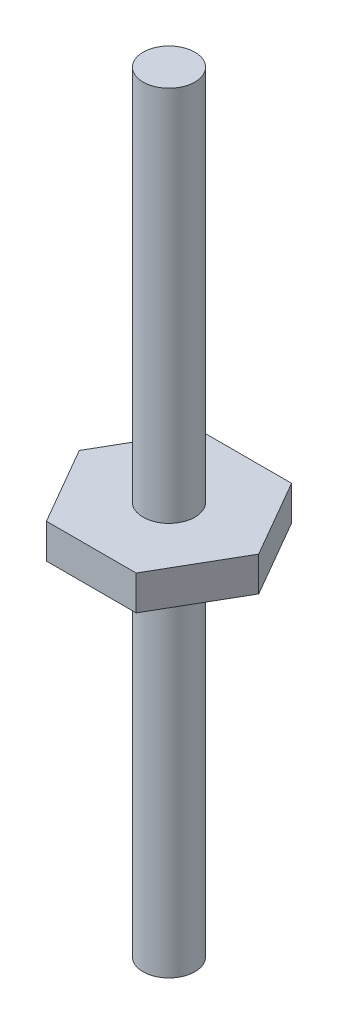
ISO-10303-21;
HEADER;
FILE_DESCRIPTION(('STEP AP214'),'2;1');
FILE_NAME('part.step','',(''),(''),'','','');
FILE_SCHEMA(('AUTOMOTIVE_DESIGN { 1 0 10303 214 1 1 1 1 }'));
ENDSEC;
DATA;
#1=APPLICATION_CONTEXT('core data for automotive mechanical design processes');
#2=APPLICATION_PROTOCOL_DEFINITION('international standard','automotive_design',2000,#1);
#3=PRODUCT_CONTEXT('',#1,'mechanical');
#4=PRODUCT('Part','Part','',(#3));
#5=PRODUCT_RELATED_PRODUCT_CATEGORY('part','',(#4));
#6=PRODUCT_DEFINITION_FORMATION('','',#4);
#7=PRODUCT_DEFINITION_CONTEXT('part definition',#1,'design');
#8=PRODUCT_DEFINITION('design','',#6,#7);
#9=PRODUCT_DEFINITION_SHAPE('','',#8);
#10=(LENGTH_UNIT() NAMED_UNIT(*) SI_UNIT(.MILLI.,.METRE.));
#11=(NAMED_UNIT(*) PLANE_ANGLE_UNIT() SI_UNIT($,.RADIAN.));
#12=(NAMED_UNIT(*) SI_UNIT($,.STERADIAN.) SOLID_ANGLE_UNIT());
#13=UNCERTAINTY_MEASURE_WITH_UNIT(LENGTH_MEASURE(1.E-05),#10,'distance_accuracy_value','');
#14=(GEOMETRIC_REPRESENTATION_CONTEXT(3) GLOBAL_UNCERTAINTY_ASSIGNED_CONTEXT((#13)) GLOBAL_UNIT_ASSIGNED_CONTEXT((#10,
#11,#12)) REPRESENTATION_CONTEXT('',''));
#15=CARTESIAN_POINT('',(0.,0.,0.));
#16=DIRECTION('',(0.,0.,1.));
#17=DIRECTION('',(1.,0.,0.));
#18=AXIS2_PLACEMENT_3D('',#15,#16,#17);
#19=CARTESIAN_POINT('',(0.,23.825,0.));
#20=DIRECTION('',(0.,-1.,0.));
#21=DIRECTION('',(0.,0.,-1.));
#22=AXIS2_PLACEMENT_3D('',#19,#20,#21);
#23=CYLINDRICAL_SURFACE('',#22,1.5);
#24=CARTESIAN_POINT('',(0.,23.825,0.));
#25=DIRECTION('',(0.,1.,0.));
#26=DIRECTION('',(0.,0.,1.));
#27=AXIS2_PLACEMENT_3D('',#24,#25,#26);
#28=CIRCLE('',#27,1.5);
#29=CARTESIAN_POINT('',(0.,23.825,1.5));
#30=VERTEX_POINT('',#29);
#31=EDGE_CURVE('E158',#30,#30,#28,.T.);
#32=ORIENTED_EDGE('',*,*,#31,.F.);
#33=EDGE_LOOP('',(#32));
#34=FACE_BOUND('',#33,.T.);
#35=CARTESIAN_POINT('',(0.,2.,0.));
#36=DIRECTION('',(0.,-1.,0.));
#37=DIRECTION('',(0.,0.,-1.));
#38=AXIS2_PLACEMENT_3D('',#35,#36,#37);
#39=CIRCLE('',#38,1.5);
#40=CARTESIAN_POINT('',(0.,2.,-1.5));
#41=VERTEX_POINT('',#40);
#42=EDGE_CURVE('E42',#41,#41,#39,.T.);
#43=ORIENTED_EDGE('',*,*,#42,.F.);
#44=EDGE_LOOP('',(#43));
#45=FACE_BOUND('',#44,.T.);
#46=ADVANCED_FACE('F39',(#34,#45),#23,.T.);
#47=CARTESIAN_POINT('',(0.,23.825,0.));
#48=DIRECTION('',(0.,1.,0.));
#49=DIRECTION('',(0.,0.,1.));
#50=AXIS2_PLACEMENT_3D('',#47,#48,#49);
#51=PLANE('',#50);
#52=ORIENTED_EDGE('',*,*,#31,.T.);
#53=EDGE_LOOP('',(#52));
#54=FACE_BOUND('',#53,.T.);
#55=ADVANCED_FACE('F177',(#54),#51,.T.);
#56=CARTESIAN_POINT('',(-2.59807621135332,2.,4.5));
#57=DIRECTION('',(-0.866025403784439,0.,0.5));
#58=DIRECTION('',(0.5,0.,0.866025403784439));
#59=AXIS2_PLACEMENT_3D('',#56,#57,#58);
#60=PLANE('',#59);
#61=DIRECTION('',(-0.5,0.,-0.866025403784439));
#62=VECTOR('',#61,1.);
#63=CARTESIAN_POINT('',(-2.59807621135332,0.,4.5));
#64=LINE('',#63,#62);
#65=CARTESIAN_POINT('',(-2.59807621135332,0.,4.5));
#66=VERTEX_POINT('',#65);
#67=CARTESIAN_POINT('',(-5.19615242270663,0.,0.));
#68=VERTEX_POINT('',#67);
#69=EDGE_CURVE('E133',#66,#68,#64,.T.);
#70=ORIENTED_EDGE('',*,*,#69,.F.);
#71=DIRECTION('',(0.,-1.,0.));
#72=VECTOR('',#71,1.);
#73=CARTESIAN_POINT('',(-2.59807621135332,2.,4.5));
#74=LINE('',#73,#72);
#75=CARTESIAN_POINT('',(-2.59807621135332,2.,4.5));
#76=VERTEX_POINT('',#75);
#77=EDGE_CURVE('E57',#76,#66,#74,.T.);
#78=ORIENTED_EDGE('',*,*,#77,.F.);
#79=DIRECTION('',(-0.5,0.,-0.866025403784439));
#80=VECTOR('',#79,1.);
#81=CARTESIAN_POINT('',(-2.59807621135332,2.,4.5));
#82=LINE('',#81,#80);
#83=CARTESIAN_POINT('',(-5.19615242270663,2.,0.));
#84=VERTEX_POINT('',#83);
#85=EDGE_CURVE('E155',#76,#84,#82,.T.);
#86=ORIENTED_EDGE('',*,*,#85,.T.);
#87=DIRECTION('',(0.,-1.,0.));
#88=VECTOR('',#87,1.);
#89=CARTESIAN_POINT('',(-5.19615242270663,2.,0.));
#90=LINE('',#89,#88);
#91=EDGE_CURVE('E92',#84,#68,#90,.T.);
#92=ORIENTED_EDGE('',*,*,#91,.T.);
#93=EDGE_LOOP('',(#70,#78,#86,#92));
#94=FACE_BOUND('',#93,.T.);
#95=ADVANCED_FACE('F182',(#94),#60,.T.);
#96=CARTESIAN_POINT('',(2.59807621135332,2.,4.5));
#97=DIRECTION('',(0.,0.,1.));
#98=DIRECTION('',(1.,0.,0.));
#99=AXIS2_PLACEMENT_3D('',#96,#97,#98);
#100=PLANE('',#99);
#101=DIRECTION('',(-1.,0.,0.));
#102=VECTOR('',#101,1.);
#103=CARTESIAN_POINT('',(2.59807621135332,0.,4.5));
#104=LINE('',#103,#102);
#105=CARTESIAN_POINT('',(2.59807621135332,0.,4.5));
#106=VERTEX_POINT('',#105);
#107=EDGE_CURVE('E151',#106,#66,#104,.T.);
#108=ORIENTED_EDGE('',*,*,#107,.F.);
#109=DIRECTION('',(0.,-1.,0.));
#110=VECTOR('',#109,1.);
#111=CARTESIAN_POINT('',(2.59807621135332,2.,4.5));
#112=LINE('',#111,#110);
#113=CARTESIAN_POINT('',(2.59807621135332,2.,4.5));
#114=VERTEX_POINT('',#113);
#115=EDGE_CURVE('E80',#114,#106,#112,.T.);
#116=ORIENTED_EDGE('',*,*,#115,.F.);
#117=DIRECTION('',(-1.,0.,0.));
#118=VECTOR('',#117,1.);
#119=CARTESIAN_POINT('',(2.59807621135332,2.,4.5));
#120=LINE('',#119,#118);
#121=EDGE_CURVE('E119',#114,#76,#120,.T.);
#122=ORIENTED_EDGE('',*,*,#121,.T.);
#123=ORIENTED_EDGE('',*,*,#77,.T.);
#124=EDGE_LOOP('',(#108,#116,#122,#123));
#125=FACE_BOUND('',#124,.T.);
#126=ADVANCED_FACE('F187',(#125),#100,.T.);
#127=CARTESIAN_POINT('',(5.19615242270663,2.,0.));
#128=DIRECTION('',(0.866025403784438,0.,0.5));
#129=DIRECTION('',(0.5,0.,-0.866025403784439));
#130=AXIS2_PLACEMENT_3D('',#127,#128,#129);
#131=PLANE('',#130);
#132=DIRECTION('',(-0.5,0.,0.866025403784438));
#133=VECTOR('',#132,1.);
#134=CARTESIAN_POINT('',(5.19615242270663,0.,0.));
#135=LINE('',#134,#133);
#136=CARTESIAN_POINT('',(5.19615242270663,0.,0.));
#137=VERTEX_POINT('',#136);
#138=EDGE_CURVE('E105',#137,#106,#135,.T.);
#139=ORIENTED_EDGE('',*,*,#138,.F.);
#140=DIRECTION('',(0.,-1.,0.));
#141=VECTOR('',#140,1.);
#142=CARTESIAN_POINT('',(5.19615242270663,2.,0.));
#143=LINE('',#142,#141);
#144=CARTESIAN_POINT('',(5.19615242270663,2.,0.));
#145=VERTEX_POINT('',#144);
#146=EDGE_CURVE('E100',#145,#137,#143,.T.);
#147=ORIENTED_EDGE('',*,*,#146,.F.);
#148=DIRECTION('',(-0.5,0.,0.866025403784438));
#149=VECTOR('',#148,1.);
#150=CARTESIAN_POINT('',(5.19615242270663,2.,0.));
#151=LINE('',#150,#149);
#152=EDGE_CURVE('E103',#145,#114,#151,.T.);
#153=ORIENTED_EDGE('',*,*,#152,.T.);
#154=ORIENTED_EDGE('',*,*,#115,.T.);
#155=EDGE_LOOP('',(#139,#147,#153,#154));
#156=FACE_BOUND('',#155,.T.);
#157=ADVANCED_FACE('F102',(#156),#131,.T.);
#158=CARTESIAN_POINT('',(2.59807621135332,2.,-4.5));
#159=DIRECTION('',(0.866025403784439,0.,-0.5));
#160=DIRECTION('',(-0.5,0.,-0.866025403784439));
#161=AXIS2_PLACEMENT_3D('',#158,#159,#160);
#162=PLANE('',#161);
#163=DIRECTION('',(0.5,0.,0.866025403784439));
#164=VECTOR('',#163,1.);
#165=CARTESIAN_POINT('',(2.59807621135332,0.,-4.5));
#166=LINE('',#165,#164);
#167=CARTESIAN_POINT('',(2.59807621135332,0.,-4.5));
#168=VERTEX_POINT('',#167);
#169=EDGE_CURVE('E146',#168,#137,#166,.T.);
#170=ORIENTED_EDGE('',*,*,#169,.F.);
#171=DIRECTION('',(0.,-1.,0.));
#172=VECTOR('',#171,1.);
#173=CARTESIAN_POINT('',(2.59807621135332,2.,-4.5));
#174=LINE('',#173,#172);
#175=CARTESIAN_POINT('',(2.59807621135332,2.,-4.5));
#176=VERTEX_POINT('',#175);
#177=EDGE_CURVE('E111',#176,#168,#174,.T.);
#178=ORIENTED_EDGE('',*,*,#177,.F.);
#179=DIRECTION('',(0.5,0.,0.866025403784439));
#180=VECTOR('',#179,1.);
#181=CARTESIAN_POINT('',(2.59807621135332,2.,-4.5));
#182=LINE('',#181,#180);
#183=EDGE_CURVE('E117',#176,#145,#182,.T.);
#184=ORIENTED_EDGE('',*,*,#183,.T.);
#185=ORIENTED_EDGE('',*,*,#146,.T.);
#186=EDGE_LOOP('',(#170,#178,#184,#185));
#187=FACE_BOUND('',#186,.T.);
#188=ADVANCED_FACE('F122',(#187),#162,.T.);
#189=CARTESIAN_POINT('',(-2.59807621135332,2.,-4.5));
#190=DIRECTION('',(0.,0.,-1.));
#191=DIRECTION('',(-1.,0.,0.));
#192=AXIS2_PLACEMENT_3D('',#189,#190,#191);
#193=PLANE('',#192);
#194=DIRECTION('',(1.,0.,0.));
#195=VECTOR('',#194,1.);
#196=CARTESIAN_POINT('',(-2.59807621135332,0.,-4.5));
#197=LINE('',#196,#195);
#198=CARTESIAN_POINT('',(-2.59807621135332,0.,-4.5));
#199=VERTEX_POINT('',#198);
#200=EDGE_CURVE('E142',#199,#168,#197,.T.);
#201=ORIENTED_EDGE('',*,*,#200,.F.);
#202=DIRECTION('',(0.,-1.,0.));
#203=VECTOR('',#202,1.);
#204=CARTESIAN_POINT('',(-2.59807621135332,2.,-4.5));
#205=LINE('',#204,#203);
#206=CARTESIAN_POINT('',(-2.59807621135332,2.,-4.5));
#207=VERTEX_POINT('',#206);
#208=EDGE_CURVE('E163',#207,#199,#205,.T.);
#209=ORIENTED_EDGE('',*,*,#208,.F.);
#210=DIRECTION('',(1.,0.,0.));
#211=VECTOR('',#210,1.);
#212=CARTESIAN_POINT('',(-2.59807621135332,2.,-4.5));
#213=LINE('',#212,#211);
#214=EDGE_CURVE('E124',#207,#176,#213,.T.);
#215=ORIENTED_EDGE('',*,*,#214,.T.);
#216=ORIENTED_EDGE('',*,*,#177,.T.);
#217=EDGE_LOOP('',(#201,#209,#215,#216));
#218=FACE_BOUND('',#217,.T.);
#219=ADVANCED_FACE('F207',(#218),#193,.T.);
#220=CARTESIAN_POINT('',(-5.19615242270663,2.,0.));
#221=DIRECTION('',(-0.866025403784439,0.,-0.5));
#222=DIRECTION('',(-0.5,0.,0.866025403784439));
#223=AXIS2_PLACEMENT_3D('',#220,#221,#222);
#224=PLANE('',#223);
#225=DIRECTION('',(0.5,0.,-0.866025403784439));
#226=VECTOR('',#225,1.);
#227=CARTESIAN_POINT('',(-5.19615242270663,0.,0.));
#228=LINE('',#227,#226);
#229=EDGE_CURVE('E137',#68,#199,#228,.T.);
#230=ORIENTED_EDGE('',*,*,#229,.F.);
#231=ORIENTED_EDGE('',*,*,#91,.F.);
#232=DIRECTION('',(0.5,0.,-0.866025403784439));
#233=VECTOR('',#232,1.);
#234=CARTESIAN_POINT('',(-5.19615242270663,2.,0.));
#235=LINE('',#234,#233);
#236=EDGE_CURVE('E127',#84,#207,#235,.T.);
#237=ORIENTED_EDGE('',*,*,#236,.T.);
#238=ORIENTED_EDGE('',*,*,#208,.T.);
#239=EDGE_LOOP('',(#230,#231,#237,#238));
#240=FACE_BOUND('',#239,.T.);
#241=ADVANCED_FACE('F201',(#240),#224,.T.);
#242=CARTESIAN_POINT('',(0.,2.,0.));
#243=DIRECTION('',(0.,-1.,0.));
#244=DIRECTION('',(0.,0.,-1.));
#245=AXIS2_PLACEMENT_3D('',#242,#243,#244);
#246=PLANE('',#245);
#247=ORIENTED_EDGE('',*,*,#42,.T.);
#248=EDGE_LOOP('',(#247));
#249=FACE_BOUND('',#248,.T.);
#250=ORIENTED_EDGE('',*,*,#85,.F.);
#251=ORIENTED_EDGE('',*,*,#121,.F.);
#252=ORIENTED_EDGE('',*,*,#152,.F.);
#253=ORIENTED_EDGE('',*,*,#183,.F.);
#254=ORIENTED_EDGE('',*,*,#214,.F.);
#255=ORIENTED_EDGE('',*,*,#236,.F.);
#256=EDGE_LOOP('',(#250,#251,#252,#253,#254,#255));
#257=FACE_BOUND('',#256,.T.);
#258=ADVANCED_FACE('F115',(#249,#257),#246,.F.);
#259=CARTESIAN_POINT('',(0.,0.,0.));
#260=DIRECTION('',(0.,1.,0.));
#261=DIRECTION('',(0.,0.,1.));
#262=AXIS2_PLACEMENT_3D('',#259,#260,#261);
#263=PLANE('',#262);
#264=CARTESIAN_POINT('',(0.,0.,0.));
#265=DIRECTION('',(0.,-1.,0.));
#266=DIRECTION('',(0.,0.,-1.));
#267=AXIS2_PLACEMENT_3D('',#264,#265,#266);
#268=CIRCLE('',#267,1.5);
#269=CARTESIAN_POINT('',(0.,0.,-1.5));
#270=VERTEX_POINT('',#269);
#271=EDGE_CURVE('E11',#270,#270,#268,.T.);
#272=ORIENTED_EDGE('',*,*,#271,.F.);
#273=EDGE_LOOP('',(#272));
#274=FACE_BOUND('',#273,.T.);
#275=ORIENTED_EDGE('',*,*,#69,.T.);
#276=ORIENTED_EDGE('',*,*,#229,.T.);
#277=ORIENTED_EDGE('',*,*,#200,.T.);
#278=ORIENTED_EDGE('',*,*,#169,.T.);
#279=ORIENTED_EDGE('',*,*,#138,.T.);
#280=ORIENTED_EDGE('',*,*,#107,.T.);
#281=EDGE_LOOP('',(#275,#276,#277,#278,#279,#280));
#282=FACE_BOUND('',#281,.T.);
#283=ADVANCED_FACE('F190',(#274,#282),#263,.F.);
#284=CARTESIAN_POINT('',(0.,-20.8,0.));
#285=DIRECTION('',(0.,1.,0.));
#286=DIRECTION('',(0.,0.,1.));
#287=AXIS2_PLACEMENT_3D('',#284,#285,#286);
#288=CYLINDRICAL_SURFACE('',#287,1.5);
#289=CARTESIAN_POINT('',(0.,-20.8,0.));
#290=DIRECTION('',(0.,-1.,0.));
#291=DIRECTION('',(0.,0.,-1.));
#292=AXIS2_PLACEMENT_3D('',#289,#290,#291);
#293=CIRCLE('',#292,1.5);
#294=CARTESIAN_POINT('',(0.,-20.8,-1.5));
#295=VERTEX_POINT('',#294);
#296=EDGE_CURVE('E138',#295,#295,#293,.T.);
#297=ORIENTED_EDGE('',*,*,#296,.F.);
#298=EDGE_LOOP('',(#297));
#299=FACE_BOUND('',#298,.T.);
#300=ORIENTED_EDGE('',*,*,#271,.T.);
#301=EDGE_LOOP('',(#300));
#302=FACE_BOUND('',#301,.T.);
#303=ADVANCED_FACE('F192',(#299,#302),#288,.T.);
#304=CARTESIAN_POINT('',(0.,-20.8,0.));
#305=DIRECTION('',(0.,-1.,0.));
#306=DIRECTION('',(0.,0.,-1.));
#307=AXIS2_PLACEMENT_3D('',#304,#305,#306);
#308=PLANE('',#307);
#309=ORIENTED_EDGE('',*,*,#296,.T.);
#310=EDGE_LOOP('',(#309));
#311=FACE_BOUND('',#310,.T.);
#312=ADVANCED_FACE('F198',(#311),#308,.T.);
#313=CLOSED_SHELL('',(#46,#55,#95,#126,#157,#188,#219,#241,#258,#283,#303,#312));
#314=MANIFOLD_SOLID_BREP('B2',#313);
#315=ADVANCED_BREP_SHAPE_REPRESENTATION('',(#18,#314),#14);
#316=SHAPE_DEFINITION_REPRESENTATION(#9,#315);
ENDSEC;
END-ISO-10303-21;
